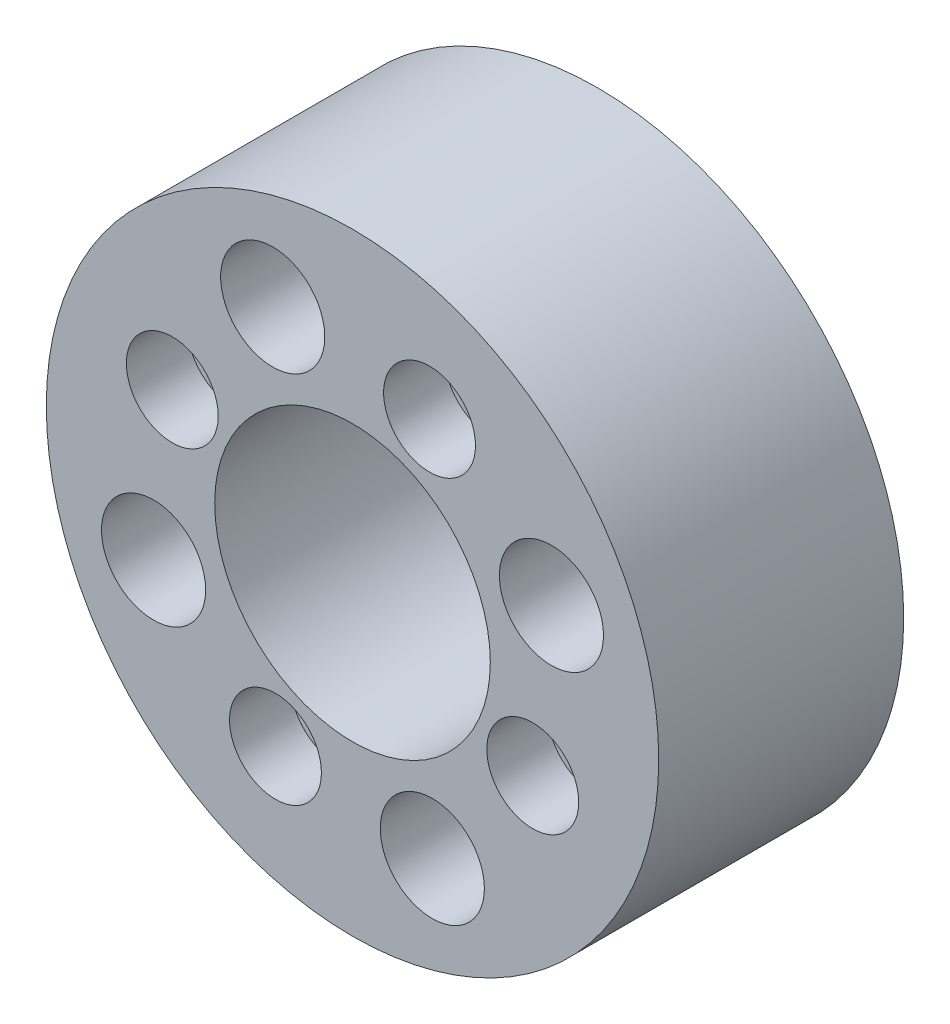
ISO-10303-21;
HEADER;
FILE_DESCRIPTION(('STEP AP214'),'2;1');
FILE_NAME('part.step','',(''),(''),'','','');
FILE_SCHEMA(('AUTOMOTIVE_DESIGN { 1 0 10303 214 1 1 1 1 }'));
ENDSEC;
DATA;
#1=APPLICATION_CONTEXT('core data for automotive mechanical design processes');
#2=APPLICATION_PROTOCOL_DEFINITION('international standard','automotive_design',2000,#1);
#3=PRODUCT_CONTEXT('',#1,'mechanical');
#4=PRODUCT('Part','Part','',(#3));
#5=PRODUCT_RELATED_PRODUCT_CATEGORY('part','',(#4));
#6=PRODUCT_DEFINITION_FORMATION('','',#4);
#7=PRODUCT_DEFINITION_CONTEXT('part definition',#1,'design');
#8=PRODUCT_DEFINITION('design','',#6,#7);
#9=PRODUCT_DEFINITION_SHAPE('','',#8);
#10=(LENGTH_UNIT() NAMED_UNIT(*) SI_UNIT(.MILLI.,.METRE.));
#11=(NAMED_UNIT(*) PLANE_ANGLE_UNIT() SI_UNIT($,.RADIAN.));
#12=(NAMED_UNIT(*) SI_UNIT($,.STERADIAN.) SOLID_ANGLE_UNIT());
#13=UNCERTAINTY_MEASURE_WITH_UNIT(LENGTH_MEASURE(1.E-05),#10,'distance_accuracy_value','');
#14=(GEOMETRIC_REPRESENTATION_CONTEXT(3) GLOBAL_UNCERTAINTY_ASSIGNED_CONTEXT((#13)) GLOBAL_UNIT_ASSIGNED_CONTEXT((#10,
#11,#12)) REPRESENTATION_CONTEXT('',''));
#15=CARTESIAN_POINT('',(0.,0.,0.));
#16=DIRECTION('',(0.,0.,1.));
#17=DIRECTION('',(1.,0.,0.));
#18=AXIS2_PLACEMENT_3D('',#15,#16,#17);
#19=CARTESIAN_POINT('',(-14.7133858318789,6.28619736901935,0.));
#20=DIRECTION('',(0.,0.,1.));
#21=DIRECTION('',(1.,0.,0.));
#22=AXIS2_PLACEMENT_3D('',#19,#20,#21);
#23=CYLINDRICAL_SURFACE('',#22,2.5);
#24=CARTESIAN_POINT('',(-14.7133858318789,6.28619736901935,0.));
#25=DIRECTION('',(0.,0.,1.));
#26=DIRECTION('',(1.,0.,0.));
#27=AXIS2_PLACEMENT_3D('',#24,#25,#26);
#28=CIRCLE('',#27,2.5);
#29=CARTESIAN_POINT('',(-12.2133858318789,6.28619736901935,0.));
#30=VERTEX_POINT('',#29);
#31=EDGE_CURVE('E79',#30,#30,#28,.T.);
#32=ORIENTED_EDGE('',*,*,#31,.F.);
#33=EDGE_LOOP('',(#32));
#34=FACE_BOUND('',#33,.T.);
#35=CARTESIAN_POINT('',(-14.7133858318789,6.28619736901935,15.));
#36=DIRECTION('',(0.,0.,1.));
#37=DIRECTION('',(1.,0.,0.));
#38=AXIS2_PLACEMENT_3D('',#35,#36,#37);
#39=CIRCLE('',#38,2.5);
#40=CARTESIAN_POINT('',(-12.2133858318789,6.28619736901935,15.));
#41=VERTEX_POINT('',#40);
#42=EDGE_CURVE('E37',#41,#41,#39,.F.);
#43=ORIENTED_EDGE('',*,*,#42,.F.);
#44=EDGE_LOOP('',(#43));
#45=FACE_BOUND('',#44,.T.);
#46=ADVANCED_FACE('F33',(#34,#45),#23,.F.);
#47=CARTESIAN_POINT('',(14.7133858318789,-6.28619736901935,0.));
#48=DIRECTION('',(0.,0.,1.));
#49=DIRECTION('',(1.,0.,0.));
#50=AXIS2_PLACEMENT_3D('',#47,#48,#49);
#51=CYLINDRICAL_SURFACE('',#50,2.5);
#52=CARTESIAN_POINT('',(14.7133858318789,-6.28619736901935,0.));
#53=DIRECTION('',(0.,0.,1.));
#54=DIRECTION('',(1.,0.,0.));
#55=AXIS2_PLACEMENT_3D('',#52,#53,#54);
#56=CIRCLE('',#55,2.5);
#57=CARTESIAN_POINT('',(17.2133858318789,-6.28619736901935,0.));
#58=VERTEX_POINT('',#57);
#59=EDGE_CURVE('E80',#58,#58,#56,.T.);
#60=ORIENTED_EDGE('',*,*,#59,.F.);
#61=EDGE_LOOP('',(#60));
#62=FACE_BOUND('',#61,.T.);
#63=CARTESIAN_POINT('',(14.7133858318789,-6.28619736901935,15.));
#64=DIRECTION('',(0.,0.,1.));
#65=DIRECTION('',(1.,0.,0.));
#66=AXIS2_PLACEMENT_3D('',#63,#64,#65);
#67=CIRCLE('',#66,2.5);
#68=CARTESIAN_POINT('',(17.2133858318789,-6.28619736901935,15.));
#69=VERTEX_POINT('',#68);
#70=EDGE_CURVE('E59',#69,#69,#67,.F.);
#71=ORIENTED_EDGE('',*,*,#70,.F.);
#72=EDGE_LOOP('',(#71));
#73=FACE_BOUND('',#72,.T.);
#74=ADVANCED_FACE('F109',(#62,#73),#51,.F.);
#75=CARTESIAN_POINT('',(6.28955657002016,14.7119501818255,0.));
#76=DIRECTION('',(0.,0.,1.));
#77=DIRECTION('',(1.,0.,0.));
#78=AXIS2_PLACEMENT_3D('',#75,#76,#77);
#79=CYLINDRICAL_SURFACE('',#78,2.5);
#80=CARTESIAN_POINT('',(6.28955657002016,14.7119501818255,0.));
#81=DIRECTION('',(0.,0.,1.));
#82=DIRECTION('',(1.,0.,0.));
#83=AXIS2_PLACEMENT_3D('',#80,#81,#82);
#84=CIRCLE('',#83,2.5);
#85=CARTESIAN_POINT('',(8.78955657002016,14.7119501818255,0.));
#86=VERTEX_POINT('',#85);
#87=EDGE_CURVE('E76',#86,#86,#84,.T.);
#88=ORIENTED_EDGE('',*,*,#87,.F.);
#89=EDGE_LOOP('',(#88));
#90=FACE_BOUND('',#89,.T.);
#91=CARTESIAN_POINT('',(6.28955657002016,14.7119501818255,15.));
#92=DIRECTION('',(0.,0.,1.));
#93=DIRECTION('',(1.,0.,0.));
#94=AXIS2_PLACEMENT_3D('',#91,#92,#93);
#95=CIRCLE('',#94,2.5);
#96=CARTESIAN_POINT('',(8.78955657002016,14.7119501818255,15.));
#97=VERTEX_POINT('',#96);
#98=EDGE_CURVE('E57',#97,#97,#95,.F.);
#99=ORIENTED_EDGE('',*,*,#98,.F.);
#100=EDGE_LOOP('',(#99));
#101=FACE_BOUND('',#100,.T.);
#102=ADVANCED_FACE('F114',(#90,#101),#79,.F.);
#103=CARTESIAN_POINT('',(-6.28955657002016,-14.7119501818255,0.));
#104=DIRECTION('',(0.,0.,1.));
#105=DIRECTION('',(1.,0.,0.));
#106=AXIS2_PLACEMENT_3D('',#103,#104,#105);
#107=CYLINDRICAL_SURFACE('',#106,2.5);
#108=CARTESIAN_POINT('',(-6.28955657002016,-14.7119501818255,0.));
#109=DIRECTION('',(0.,0.,1.));
#110=DIRECTION('',(1.,0.,0.));
#111=AXIS2_PLACEMENT_3D('',#108,#109,#110);
#112=CIRCLE('',#111,2.5);
#113=CARTESIAN_POINT('',(-3.78955657002016,-14.7119501818255,0.));
#114=VERTEX_POINT('',#113);
#115=EDGE_CURVE('E55',#114,#114,#112,.T.);
#116=ORIENTED_EDGE('',*,*,#115,.F.);
#117=EDGE_LOOP('',(#116));
#118=FACE_BOUND('',#117,.T.);
#119=CARTESIAN_POINT('',(-6.28955657002016,-14.7119501818255,15.));
#120=DIRECTION('',(0.,0.,1.));
#121=DIRECTION('',(1.,0.,0.));
#122=AXIS2_PLACEMENT_3D('',#119,#120,#121);
#123=CIRCLE('',#122,2.5);
#124=CARTESIAN_POINT('',(-3.78955657002016,-14.7119501818255,15.));
#125=VERTEX_POINT('',#124);
#126=EDGE_CURVE('E52',#125,#125,#123,.F.);
#127=ORIENTED_EDGE('',*,*,#126,.F.);
#128=EDGE_LOOP('',(#127));
#129=FACE_BOUND('',#128,.T.);
#130=ADVANCED_FACE('F120',(#118,#129),#107,.F.);
#131=CARTESIAN_POINT('',(0.,0.,20.));
#132=DIRECTION('',(0.,0.,1.));
#133=DIRECTION('',(1.,0.,0.));
#134=AXIS2_PLACEMENT_3D('',#131,#132,#133);
#135=PLANE('',#134);
#136=CARTESIAN_POINT('',(16.2417804698733,6.51571693433973,20.));
#137=DIRECTION('',(0.,0.,1.));
#138=DIRECTION('',(1.,0.,0.));
#139=AXIS2_PLACEMENT_3D('',#136,#137,#138);
#140=CIRCLE('',#139,4.25);
#141=CARTESIAN_POINT('',(20.4917804698733,6.51571693433973,20.));
#142=VERTEX_POINT('',#141);
#143=EDGE_CURVE('E192',#142,#142,#140,.T.);
#144=ORIENTED_EDGE('',*,*,#143,.F.);
#145=EDGE_LOOP('',(#144));
#146=FACE_BOUND('',#145,.T.);
#147=CARTESIAN_POINT('',(-16.2417804698733,-6.51571693433974,20.));
#148=DIRECTION('',(0.,0.,1.));
#149=DIRECTION('',(1.,0.,0.));
#150=AXIS2_PLACEMENT_3D('',#147,#148,#149);
#151=CIRCLE('',#150,4.25);
#152=CARTESIAN_POINT('',(-11.9917804698733,-6.51571693433974,20.));
#153=VERTEX_POINT('',#152);
#154=EDGE_CURVE('E203',#153,#153,#151,.T.);
#155=ORIENTED_EDGE('',*,*,#154,.F.);
#156=EDGE_LOOP('',(#155));
#157=FACE_BOUND('',#156,.T.);
#158=CARTESIAN_POINT('',(-6.51571693433974,16.2417804698733,20.));
#159=DIRECTION('',(0.,0.,1.));
#160=DIRECTION('',(1.,0.,0.));
#161=AXIS2_PLACEMENT_3D('',#158,#159,#160);
#162=CIRCLE('',#161,4.25);
#163=CARTESIAN_POINT('',(-2.26571693433974,16.2417804698733,20.));
#164=VERTEX_POINT('',#163);
#165=EDGE_CURVE('E209',#164,#164,#162,.T.);
#166=ORIENTED_EDGE('',*,*,#165,.F.);
#167=EDGE_LOOP('',(#166));
#168=FACE_BOUND('',#167,.T.);
#169=CARTESIAN_POINT('',(6.51571693433974,-16.2417804698733,20.));
#170=DIRECTION('',(0.,0.,1.));
#171=DIRECTION('',(1.,0.,0.));
#172=AXIS2_PLACEMENT_3D('',#169,#170,#171);
#173=CIRCLE('',#172,4.25);
#174=CARTESIAN_POINT('',(10.7657169343397,-16.2417804698733,20.));
#175=VERTEX_POINT('',#174);
#176=EDGE_CURVE('E191',#175,#175,#173,.T.);
#177=ORIENTED_EDGE('',*,*,#176,.F.);
#178=EDGE_LOOP('',(#177));
#179=FACE_BOUND('',#178,.T.);
#180=CARTESIAN_POINT('',(14.7133858318789,-6.28619736901935,20.));
#181=DIRECTION('',(0.,0.,1.));
#182=DIRECTION('',(1.,0.,0.));
#183=AXIS2_PLACEMENT_3D('',#180,#181,#182);
#184=CIRCLE('',#183,3.75);
#185=CARTESIAN_POINT('',(18.4633858318789,-6.28619736901935,20.));
#186=VERTEX_POINT('',#185);
#187=EDGE_CURVE('E217',#186,#186,#184,.T.);
#188=ORIENTED_EDGE('',*,*,#187,.F.);
#189=EDGE_LOOP('',(#188));
#190=FACE_BOUND('',#189,.T.);
#191=CARTESIAN_POINT('',(6.28955657002016,14.7119501818255,20.));
#192=DIRECTION('',(0.,0.,1.));
#193=DIRECTION('',(1.,0.,0.));
#194=AXIS2_PLACEMENT_3D('',#191,#192,#193);
#195=CIRCLE('',#194,3.75);
#196=CARTESIAN_POINT('',(10.0395565700202,14.7119501818255,20.));
#197=VERTEX_POINT('',#196);
#198=EDGE_CURVE('E223',#197,#197,#195,.T.);
#199=ORIENTED_EDGE('',*,*,#198,.F.);
#200=EDGE_LOOP('',(#199));
#201=FACE_BOUND('',#200,.T.);
#202=CARTESIAN_POINT('',(-14.7133858318789,6.28619736901935,20.));
#203=DIRECTION('',(0.,0.,1.));
#204=DIRECTION('',(1.,0.,0.));
#205=AXIS2_PLACEMENT_3D('',#202,#203,#204);
#206=CIRCLE('',#205,3.75);
#207=CARTESIAN_POINT('',(-10.9633858318789,6.28619736901935,20.));
#208=VERTEX_POINT('',#207);
#209=EDGE_CURVE('E213',#208,#208,#206,.T.);
#210=ORIENTED_EDGE('',*,*,#209,.F.);
#211=EDGE_LOOP('',(#210));
#212=FACE_BOUND('',#211,.T.);
#213=CARTESIAN_POINT('',(-6.28955657002016,-14.7119501818255,20.));
#214=DIRECTION('',(0.,0.,1.));
#215=DIRECTION('',(1.,0.,0.));
#216=AXIS2_PLACEMENT_3D('',#213,#214,#215);
#217=CIRCLE('',#216,3.75);
#218=CARTESIAN_POINT('',(-2.53955657002016,-14.7119501818255,20.));
#219=VERTEX_POINT('',#218);
#220=EDGE_CURVE('E65',#219,#219,#217,.T.);
#221=ORIENTED_EDGE('',*,*,#220,.F.);
#222=EDGE_LOOP('',(#221));
#223=FACE_BOUND('',#222,.T.);
#224=CARTESIAN_POINT('',(0.,0.,20.));
#225=DIRECTION('',(0.,0.,1.));
#226=DIRECTION('',(1.,0.,0.));
#227=AXIS2_PLACEMENT_3D('',#224,#225,#226);
#228=CIRCLE('',#227,25.);
#229=CARTESIAN_POINT('',(25.,0.,20.));
#230=VERTEX_POINT('',#229);
#231=EDGE_CURVE('E10',#230,#230,#228,.T.);
#232=ORIENTED_EDGE('',*,*,#231,.T.);
#233=EDGE_LOOP('',(#232));
#234=FACE_BOUND('',#233,.T.);
#235=CARTESIAN_POINT('',(0.,0.,20.));
#236=DIRECTION('',(0.,0.,1.));
#237=DIRECTION('',(1.,0.,0.));
#238=AXIS2_PLACEMENT_3D('',#235,#236,#237);
#239=CIRCLE('',#238,11.25);
#240=CARTESIAN_POINT('',(11.25,0.,20.));
#241=VERTEX_POINT('',#240);
#242=EDGE_CURVE('E46',#241,#241,#239,.T.);
#243=ORIENTED_EDGE('',*,*,#242,.F.);
#244=EDGE_LOOP('',(#243));
#245=FACE_BOUND('',#244,.T.);
#246=ADVANCED_FACE('F122',(#146,#157,#168,#179,#190,#201,#212,#223,#234,#245),#135,.T.);
#247=CARTESIAN_POINT('',(0.,0.,0.));
#248=DIRECTION('',(0.,0.,1.));
#249=DIRECTION('',(1.,0.,0.));
#250=AXIS2_PLACEMENT_3D('',#247,#248,#249);
#251=PLANE('',#250);
#252=ORIENTED_EDGE('',*,*,#87,.T.);
#253=EDGE_LOOP('',(#252));
#254=FACE_BOUND('',#253,.T.);
#255=ORIENTED_EDGE('',*,*,#59,.T.);
#256=EDGE_LOOP('',(#255));
#257=FACE_BOUND('',#256,.T.);
#258=ORIENTED_EDGE('',*,*,#115,.T.);
#259=EDGE_LOOP('',(#258));
#260=FACE_BOUND('',#259,.T.);
#261=ORIENTED_EDGE('',*,*,#31,.T.);
#262=EDGE_LOOP('',(#261));
#263=FACE_BOUND('',#262,.T.);
#264=CARTESIAN_POINT('',(0.,0.,0.));
#265=DIRECTION('',(0.,0.,1.));
#266=DIRECTION('',(1.,0.,0.));
#267=AXIS2_PLACEMENT_3D('',#264,#265,#266);
#268=CIRCLE('',#267,25.);
#269=CARTESIAN_POINT('',(25.,0.,0.));
#270=VERTEX_POINT('',#269);
#271=EDGE_CURVE('E41',#270,#270,#268,.T.);
#272=ORIENTED_EDGE('',*,*,#271,.F.);
#273=EDGE_LOOP('',(#272));
#274=FACE_BOUND('',#273,.T.);
#275=CARTESIAN_POINT('',(0.,0.,0.));
#276=DIRECTION('',(0.,0.,1.));
#277=DIRECTION('',(1.,0.,0.));
#278=AXIS2_PLACEMENT_3D('',#275,#276,#277);
#279=CIRCLE('',#278,11.25);
#280=CARTESIAN_POINT('',(11.25,0.,0.));
#281=VERTEX_POINT('',#280);
#282=EDGE_CURVE('E49',#281,#281,#279,.T.);
#283=ORIENTED_EDGE('',*,*,#282,.T.);
#284=EDGE_LOOP('',(#283));
#285=FACE_BOUND('',#284,.T.);
#286=ADVANCED_FACE('F92',(#254,#257,#260,#263,#274,#285),#251,.F.);
#287=CARTESIAN_POINT('',(0.,0.,20.));
#288=DIRECTION('',(0.,0.,-1.));
#289=DIRECTION('',(-1.,0.,0.));
#290=AXIS2_PLACEMENT_3D('',#287,#288,#289);
#291=CYLINDRICAL_SURFACE('',#290,25.);
#292=ORIENTED_EDGE('',*,*,#231,.F.);
#293=EDGE_LOOP('',(#292));
#294=FACE_BOUND('',#293,.T.);
#295=ORIENTED_EDGE('',*,*,#271,.T.);
#296=EDGE_LOOP('',(#295));
#297=FACE_BOUND('',#296,.T.);
#298=ADVANCED_FACE('F35',(#294,#297),#291,.T.);
#299=CARTESIAN_POINT('',(0.,0.,20.));
#300=DIRECTION('',(0.,0.,-1.));
#301=DIRECTION('',(-1.,0.,0.));
#302=AXIS2_PLACEMENT_3D('',#299,#300,#301);
#303=CYLINDRICAL_SURFACE('',#302,11.25);
#304=ORIENTED_EDGE('',*,*,#242,.T.);
#305=EDGE_LOOP('',(#304));
#306=FACE_BOUND('',#305,.T.);
#307=ORIENTED_EDGE('',*,*,#282,.F.);
#308=EDGE_LOOP('',(#307));
#309=FACE_BOUND('',#308,.T.);
#310=ADVANCED_FACE('F94',(#306,#309),#303,.F.);
#311=CARTESIAN_POINT('',(-6.28955657002016,-14.7119501818255,15.));
#312=DIRECTION('',(0.,0.,1.));
#313=DIRECTION('',(1.,0.,0.));
#314=AXIS2_PLACEMENT_3D('',#311,#312,#313);
#315=PLANE('',#314);
#316=CARTESIAN_POINT('',(-6.28955657002016,-14.7119501818255,15.));
#317=DIRECTION('',(0.,0.,1.));
#318=DIRECTION('',(1.,0.,0.));
#319=AXIS2_PLACEMENT_3D('',#316,#317,#318);
#320=CIRCLE('',#319,3.75);
#321=CARTESIAN_POINT('',(-2.53955657002016,-14.7119501818255,15.));
#322=VERTEX_POINT('',#321);
#323=EDGE_CURVE('E56',#322,#322,#320,.T.);
#324=ORIENTED_EDGE('',*,*,#323,.T.);
#325=EDGE_LOOP('',(#324));
#326=FACE_BOUND('',#325,.T.);
#327=ORIENTED_EDGE('',*,*,#126,.T.);
#328=EDGE_LOOP('',(#327));
#329=FACE_BOUND('',#328,.T.);
#330=ADVANCED_FACE('F96',(#326,#329),#315,.T.);
#331=CARTESIAN_POINT('',(-6.28955657002016,-14.7119501818255,15.));
#332=DIRECTION('',(0.,0.,1.));
#333=DIRECTION('',(1.,0.,0.));
#334=AXIS2_PLACEMENT_3D('',#331,#332,#333);
#335=CYLINDRICAL_SURFACE('',#334,3.75);
#336=ORIENTED_EDGE('',*,*,#323,.F.);
#337=EDGE_LOOP('',(#336));
#338=FACE_BOUND('',#337,.T.);
#339=ORIENTED_EDGE('',*,*,#220,.T.);
#340=EDGE_LOOP('',(#339));
#341=FACE_BOUND('',#340,.T.);
#342=ADVANCED_FACE('F102',(#338,#341),#335,.F.);
#343=CARTESIAN_POINT('',(6.28955657002016,14.7119501818255,15.));
#344=DIRECTION('',(0.,0.,1.));
#345=DIRECTION('',(1.,0.,0.));
#346=AXIS2_PLACEMENT_3D('',#343,#344,#345);
#347=PLANE('',#346);
#348=CARTESIAN_POINT('',(6.28955657002016,14.7119501818255,15.));
#349=DIRECTION('',(0.,0.,1.));
#350=DIRECTION('',(1.,0.,0.));
#351=AXIS2_PLACEMENT_3D('',#348,#349,#350);
#352=CIRCLE('',#351,3.75);
#353=CARTESIAN_POINT('',(10.0395565700202,14.7119501818255,15.));
#354=VERTEX_POINT('',#353);
#355=EDGE_CURVE('E220',#354,#354,#352,.T.);
#356=ORIENTED_EDGE('',*,*,#355,.T.);
#357=EDGE_LOOP('',(#356));
#358=FACE_BOUND('',#357,.T.);
#359=ORIENTED_EDGE('',*,*,#98,.T.);
#360=EDGE_LOOP('',(#359));
#361=FACE_BOUND('',#360,.T.);
#362=ADVANCED_FACE('F129',(#358,#361),#347,.T.);
#363=CARTESIAN_POINT('',(6.28955657002016,14.7119501818255,15.));
#364=DIRECTION('',(0.,0.,1.));
#365=DIRECTION('',(1.,0.,0.));
#366=AXIS2_PLACEMENT_3D('',#363,#364,#365);
#367=CYLINDRICAL_SURFACE('',#366,3.75);
#368=ORIENTED_EDGE('',*,*,#355,.F.);
#369=EDGE_LOOP('',(#368));
#370=FACE_BOUND('',#369,.T.);
#371=ORIENTED_EDGE('',*,*,#198,.T.);
#372=EDGE_LOOP('',(#371));
#373=FACE_BOUND('',#372,.T.);
#374=ADVANCED_FACE('F142',(#370,#373),#367,.F.);
#375=CARTESIAN_POINT('',(14.7133858318789,-6.28619736901935,15.));
#376=DIRECTION('',(0.,0.,1.));
#377=DIRECTION('',(1.,0.,0.));
#378=AXIS2_PLACEMENT_3D('',#375,#376,#377);
#379=PLANE('',#378);
#380=CARTESIAN_POINT('',(14.7133858318789,-6.28619736901935,15.));
#381=DIRECTION('',(0.,0.,1.));
#382=DIRECTION('',(1.,0.,0.));
#383=AXIS2_PLACEMENT_3D('',#380,#381,#382);
#384=CIRCLE('',#383,3.75);
#385=CARTESIAN_POINT('',(18.4633858318789,-6.28619736901935,15.));
#386=VERTEX_POINT('',#385);
#387=EDGE_CURVE('E60',#386,#386,#384,.T.);
#388=ORIENTED_EDGE('',*,*,#387,.T.);
#389=EDGE_LOOP('',(#388));
#390=FACE_BOUND('',#389,.T.);
#391=ORIENTED_EDGE('',*,*,#70,.T.);
#392=EDGE_LOOP('',(#391));
#393=FACE_BOUND('',#392,.T.);
#394=ADVANCED_FACE('F145',(#390,#393),#379,.T.);
#395=CARTESIAN_POINT('',(14.7133858318789,-6.28619736901935,15.));
#396=DIRECTION('',(0.,0.,1.));
#397=DIRECTION('',(1.,0.,0.));
#398=AXIS2_PLACEMENT_3D('',#395,#396,#397);
#399=CYLINDRICAL_SURFACE('',#398,3.75);
#400=ORIENTED_EDGE('',*,*,#387,.F.);
#401=EDGE_LOOP('',(#400));
#402=FACE_BOUND('',#401,.T.);
#403=ORIENTED_EDGE('',*,*,#187,.T.);
#404=EDGE_LOOP('',(#403));
#405=FACE_BOUND('',#404,.T.);
#406=ADVANCED_FACE('F140',(#402,#405),#399,.F.);
#407=CARTESIAN_POINT('',(-14.7133858318789,6.28619736901935,15.));
#408=DIRECTION('',(0.,0.,1.));
#409=DIRECTION('',(1.,0.,0.));
#410=AXIS2_PLACEMENT_3D('',#407,#408,#409);
#411=PLANE('',#410);
#412=CARTESIAN_POINT('',(-14.7133858318789,6.28619736901935,15.));
#413=DIRECTION('',(0.,0.,1.));
#414=DIRECTION('',(1.,0.,0.));
#415=AXIS2_PLACEMENT_3D('',#412,#413,#414);
#416=CIRCLE('',#415,3.75);
#417=CARTESIAN_POINT('',(-10.9633858318789,6.28619736901935,15.));
#418=VERTEX_POINT('',#417);
#419=EDGE_CURVE('E226',#418,#418,#416,.T.);
#420=ORIENTED_EDGE('',*,*,#419,.T.);
#421=EDGE_LOOP('',(#420));
#422=FACE_BOUND('',#421,.T.);
#423=ORIENTED_EDGE('',*,*,#42,.T.);
#424=EDGE_LOOP('',(#423));
#425=FACE_BOUND('',#424,.T.);
#426=ADVANCED_FACE('F136',(#422,#425),#411,.T.);
#427=CARTESIAN_POINT('',(-14.7133858318789,6.28619736901935,15.));
#428=DIRECTION('',(0.,0.,1.));
#429=DIRECTION('',(1.,0.,0.));
#430=AXIS2_PLACEMENT_3D('',#427,#428,#429);
#431=CYLINDRICAL_SURFACE('',#430,3.75);
#432=ORIENTED_EDGE('',*,*,#419,.F.);
#433=EDGE_LOOP('',(#432));
#434=FACE_BOUND('',#433,.T.);
#435=ORIENTED_EDGE('',*,*,#209,.T.);
#436=EDGE_LOOP('',(#435));
#437=FACE_BOUND('',#436,.T.);
#438=ADVANCED_FACE('F132',(#434,#437),#431,.F.);
#439=CARTESIAN_POINT('',(6.51571693433974,-16.2417804698733,12.5));
#440=DIRECTION('',(0.,0.,1.));
#441=DIRECTION('',(1.,0.,0.));
#442=AXIS2_PLACEMENT_3D('',#439,#440,#441);
#443=CYLINDRICAL_SURFACE('',#442,4.25);
#444=CARTESIAN_POINT('',(6.51571693433974,-16.2417804698733,12.5));
#445=DIRECTION('',(0.,0.,1.));
#446=DIRECTION('',(1.,0.,0.));
#447=AXIS2_PLACEMENT_3D('',#444,#445,#446);
#448=CIRCLE('',#447,4.25);
#449=CARTESIAN_POINT('',(10.7657169343397,-16.2417804698733,12.5));
#450=VERTEX_POINT('',#449);
#451=EDGE_CURVE('E195',#450,#450,#448,.T.);
#452=ORIENTED_EDGE('',*,*,#451,.F.);
#453=EDGE_LOOP('',(#452));
#454=FACE_BOUND('',#453,.T.);
#455=ORIENTED_EDGE('',*,*,#176,.T.);
#456=EDGE_LOOP('',(#455));
#457=FACE_BOUND('',#456,.T.);
#458=ADVANCED_FACE('F135',(#454,#457),#443,.F.);
#459=CARTESIAN_POINT('',(6.51571693433974,-16.2417804698733,12.5));
#460=DIRECTION('',(0.,0.,1.));
#461=DIRECTION('',(1.,0.,0.));
#462=AXIS2_PLACEMENT_3D('',#459,#460,#461);
#463=PLANE('',#462);
#464=ORIENTED_EDGE('',*,*,#451,.T.);
#465=EDGE_LOOP('',(#464));
#466=FACE_BOUND('',#465,.T.);
#467=ADVANCED_FACE('F158',(#466),#463,.T.);
#468=CARTESIAN_POINT('',(-6.51571693433974,16.2417804698733,12.5));
#469=DIRECTION('',(0.,0.,1.));
#470=DIRECTION('',(1.,0.,0.));
#471=AXIS2_PLACEMENT_3D('',#468,#469,#470);
#472=CYLINDRICAL_SURFACE('',#471,4.25);
#473=CARTESIAN_POINT('',(-6.51571693433974,16.2417804698733,12.5));
#474=DIRECTION('',(0.,0.,1.));
#475=DIRECTION('',(1.,0.,0.));
#476=AXIS2_PLACEMENT_3D('',#473,#474,#475);
#477=CIRCLE('',#476,4.25);
#478=CARTESIAN_POINT('',(-2.26571693433974,16.2417804698733,12.5));
#479=VERTEX_POINT('',#478);
#480=EDGE_CURVE('E206',#479,#479,#477,.T.);
#481=ORIENTED_EDGE('',*,*,#480,.F.);
#482=EDGE_LOOP('',(#481));
#483=FACE_BOUND('',#482,.T.);
#484=ORIENTED_EDGE('',*,*,#165,.T.);
#485=EDGE_LOOP('',(#484));
#486=FACE_BOUND('',#485,.T.);
#487=ADVANCED_FACE('F162',(#483,#486),#472,.F.);
#488=CARTESIAN_POINT('',(-6.51571693433974,16.2417804698733,12.5));
#489=DIRECTION('',(0.,0.,1.));
#490=DIRECTION('',(1.,0.,0.));
#491=AXIS2_PLACEMENT_3D('',#488,#489,#490);
#492=PLANE('',#491);
#493=ORIENTED_EDGE('',*,*,#480,.T.);
#494=EDGE_LOOP('',(#493));
#495=FACE_BOUND('',#494,.T.);
#496=ADVANCED_FACE('F166',(#495),#492,.T.);
#497=CARTESIAN_POINT('',(-16.2417804698733,-6.51571693433974,12.5));
#498=DIRECTION('',(0.,0.,1.));
#499=DIRECTION('',(1.,0.,0.));
#500=AXIS2_PLACEMENT_3D('',#497,#498,#499);
#501=CYLINDRICAL_SURFACE('',#500,4.25);
#502=CARTESIAN_POINT('',(-16.2417804698733,-6.51571693433974,12.5));
#503=DIRECTION('',(0.,0.,1.));
#504=DIRECTION('',(1.,0.,0.));
#505=AXIS2_PLACEMENT_3D('',#502,#503,#504);
#506=CIRCLE('',#505,4.25);
#507=CARTESIAN_POINT('',(-11.9917804698733,-6.51571693433974,12.5));
#508=VERTEX_POINT('',#507);
#509=EDGE_CURVE('E198',#508,#508,#506,.T.);
#510=ORIENTED_EDGE('',*,*,#509,.F.);
#511=EDGE_LOOP('',(#510));
#512=FACE_BOUND('',#511,.T.);
#513=ORIENTED_EDGE('',*,*,#154,.T.);
#514=EDGE_LOOP('',(#513));
#515=FACE_BOUND('',#514,.T.);
#516=ADVANCED_FACE('F170',(#512,#515),#501,.F.);
#517=CARTESIAN_POINT('',(-16.2417804698733,-6.51571693433974,12.5));
#518=DIRECTION('',(0.,0.,1.));
#519=DIRECTION('',(1.,0.,0.));
#520=AXIS2_PLACEMENT_3D('',#517,#518,#519);
#521=PLANE('',#520);
#522=ORIENTED_EDGE('',*,*,#509,.T.);
#523=EDGE_LOOP('',(#522));
#524=FACE_BOUND('',#523,.T.);
#525=ADVANCED_FACE('F174',(#524),#521,.T.);
#526=CARTESIAN_POINT('',(16.2417804698733,6.51571693433973,12.5));
#527=DIRECTION('',(0.,0.,1.));
#528=DIRECTION('',(1.,0.,0.));
#529=AXIS2_PLACEMENT_3D('',#526,#527,#528);
#530=CYLINDRICAL_SURFACE('',#529,4.25);
#531=CARTESIAN_POINT('',(16.2417804698733,6.51571693433973,12.5));
#532=DIRECTION('',(0.,0.,1.));
#533=DIRECTION('',(1.,0.,0.));
#534=AXIS2_PLACEMENT_3D('',#531,#532,#533);
#535=CIRCLE('',#534,4.25);
#536=CARTESIAN_POINT('',(20.4917804698733,6.51571693433973,12.5));
#537=VERTEX_POINT('',#536);
#538=EDGE_CURVE('E190',#537,#537,#535,.T.);
#539=ORIENTED_EDGE('',*,*,#538,.F.);
#540=EDGE_LOOP('',(#539));
#541=FACE_BOUND('',#540,.T.);
#542=ORIENTED_EDGE('',*,*,#143,.T.);
#543=EDGE_LOOP('',(#542));
#544=FACE_BOUND('',#543,.T.);
#545=ADVANCED_FACE('F178',(#541,#544),#530,.F.);
#546=CARTESIAN_POINT('',(16.2417804698733,6.51571693433973,12.5));
#547=DIRECTION('',(0.,0.,1.));
#548=DIRECTION('',(1.,0.,0.));
#549=AXIS2_PLACEMENT_3D('',#546,#547,#548);
#550=PLANE('',#549);
#551=ORIENTED_EDGE('',*,*,#538,.T.);
#552=EDGE_LOOP('',(#551));
#553=FACE_BOUND('',#552,.T.);
#554=ADVANCED_FACE('F182',(#553),#550,.T.);
#555=CLOSED_SHELL('',(#46,#74,#102,#130,#246,#286,#298,#310,#330,#342,#362,#374,#394,#406,#426,
#438,#458,#467,#487,#496,#516,#525,#545,#554));
#556=MANIFOLD_SOLID_BREP('B2',#555);
#557=ADVANCED_BREP_SHAPE_REPRESENTATION('',(#18,#556),#14);
#558=SHAPE_DEFINITION_REPRESENTATION(#9,#557);
ENDSEC;
END-ISO-10303-21;
